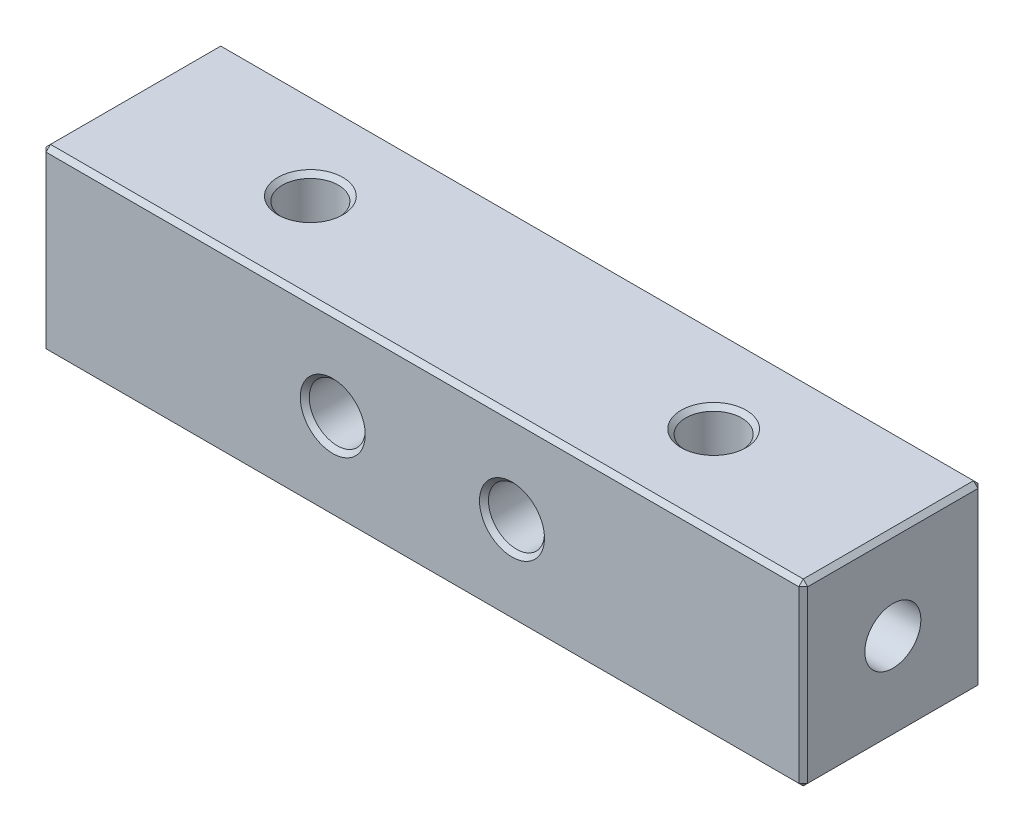
ISO-10303-21;
HEADER;
FILE_DESCRIPTION(('STEP AP214'),'2;1');
FILE_NAME('part.step','',(''),(''),'','','');
FILE_SCHEMA(('AUTOMOTIVE_DESIGN { 1 0 10303 214 1 1 1 1 }'));
ENDSEC;
DATA;
#1=APPLICATION_CONTEXT('core data for automotive mechanical design processes');
#2=APPLICATION_PROTOCOL_DEFINITION('international standard','automotive_design',2000,#1);
#3=PRODUCT_CONTEXT('',#1,'mechanical');
#4=PRODUCT('Part','Part','',(#3));
#5=PRODUCT_RELATED_PRODUCT_CATEGORY('part','',(#4));
#6=PRODUCT_DEFINITION_FORMATION('','',#4);
#7=PRODUCT_DEFINITION_CONTEXT('part definition',#1,'design');
#8=PRODUCT_DEFINITION('design','',#6,#7);
#9=PRODUCT_DEFINITION_SHAPE('','',#8);
#10=(LENGTH_UNIT() NAMED_UNIT(*) SI_UNIT(.MILLI.,.METRE.));
#11=(NAMED_UNIT(*) PLANE_ANGLE_UNIT() SI_UNIT($,.RADIAN.));
#12=(NAMED_UNIT(*) SI_UNIT($,.STERADIAN.) SOLID_ANGLE_UNIT());
#13=UNCERTAINTY_MEASURE_WITH_UNIT(LENGTH_MEASURE(1.E-05),#10,'distance_accuracy_value','');
#14=(GEOMETRIC_REPRESENTATION_CONTEXT(3) GLOBAL_UNCERTAINTY_ASSIGNED_CONTEXT((#13)) GLOBAL_UNIT_ASSIGNED_CONTEXT((#10,
#11,#12)) REPRESENTATION_CONTEXT('',''));
#15=CARTESIAN_POINT('',(0.,0.,0.));
#16=DIRECTION('',(0.,0.,1.));
#17=DIRECTION('',(1.,0.,0.));
#18=AXIS2_PLACEMENT_3D('',#15,#16,#17);
#19=CARTESIAN_POINT('',(-17.,4.,-4.));
#20=DIRECTION('',(1.,0.,0.));
#21=DIRECTION('',(0.,0.,-1.));
#22=AXIS2_PLACEMENT_3D('',#19,#20,#21);
#23=PLANE('',#22);
#24=DIRECTION('',(0.,-1.,0.));
#25=VECTOR('',#24,1.);
#26=CARTESIAN_POINT('',(-17.,4.,-3.8));
#27=LINE('',#26,#25);
#28=CARTESIAN_POINT('',(-17.,3.8,-3.8));
#29=VERTEX_POINT('',#28);
#30=CARTESIAN_POINT('',(-17.,-3.8,-3.8));
#31=VERTEX_POINT('',#30);
#32=EDGE_CURVE('E213',#29,#31,#27,.T.);
#33=ORIENTED_EDGE('',*,*,#32,.T.);
#34=DIRECTION('',(0.,0.,1.));
#35=VECTOR('',#34,1.);
#36=CARTESIAN_POINT('',(-17.,-3.8,-4.));
#37=LINE('',#36,#35);
#38=CARTESIAN_POINT('',(-17.,-3.8,3.8));
#39=VERTEX_POINT('',#38);
#40=EDGE_CURVE('E219',#31,#39,#37,.T.);
#41=ORIENTED_EDGE('',*,*,#40,.T.);
#42=DIRECTION('',(0.,1.,0.));
#43=VECTOR('',#42,1.);
#44=CARTESIAN_POINT('',(-17.,4.,3.8));
#45=LINE('',#44,#43);
#46=CARTESIAN_POINT('',(-17.,3.8,3.8));
#47=VERTEX_POINT('',#46);
#48=EDGE_CURVE('E217',#39,#47,#45,.T.);
#49=ORIENTED_EDGE('',*,*,#48,.T.);
#50=DIRECTION('',(0.,0.,-1.));
#51=VECTOR('',#50,1.);
#52=CARTESIAN_POINT('',(-17.,3.8,-4.));
#53=LINE('',#52,#51);
#54=EDGE_CURVE('E215',#47,#29,#53,.T.);
#55=ORIENTED_EDGE('',*,*,#54,.T.);
#56=EDGE_LOOP('',(#33,#41,#49,#55));
#57=FACE_BOUND('',#56,.T.);
#58=CARTESIAN_POINT('',(-17.,0.,0.));
#59=DIRECTION('',(-1.,0.,0.));
#60=DIRECTION('',(0.,0.,1.));
#61=AXIS2_PLACEMENT_3D('',#58,#59,#60);
#62=CIRCLE('',#61,1.25);
#63=CARTESIAN_POINT('',(-17.,0.,1.25));
#64=VERTEX_POINT('',#63);
#65=EDGE_CURVE('E250',#64,#64,#62,.T.);
#66=ORIENTED_EDGE('',*,*,#65,.F.);
#67=EDGE_LOOP('',(#66));
#68=FACE_BOUND('',#67,.T.);
#69=ADVANCED_FACE('F43',(#57,#68),#23,.F.);
#70=CARTESIAN_POINT('',(17.,4.,-4.));
#71=DIRECTION('',(-1.,0.,0.));
#72=DIRECTION('',(0.,0.,1.));
#73=AXIS2_PLACEMENT_3D('',#70,#71,#72);
#74=PLANE('',#73);
#75=CARTESIAN_POINT('',(17.,0.,0.));
#76=DIRECTION('',(1.,0.,0.));
#77=DIRECTION('',(0.,0.,-1.));
#78=AXIS2_PLACEMENT_3D('',#75,#76,#77);
#79=CIRCLE('',#78,1.24999999999999);
#80=CARTESIAN_POINT('',(17.,0.,-1.24999999999999));
#81=VERTEX_POINT('',#80);
#82=EDGE_CURVE('E326',#81,#81,#79,.T.);
#83=ORIENTED_EDGE('',*,*,#82,.F.);
#84=EDGE_LOOP('',(#83));
#85=FACE_BOUND('',#84,.T.);
#86=DIRECTION('',(0.,-1.,0.));
#87=VECTOR('',#86,1.);
#88=CARTESIAN_POINT('',(17.,4.,3.8));
#89=LINE('',#88,#87);
#90=CARTESIAN_POINT('',(17.,3.8,3.8));
#91=VERTEX_POINT('',#90);
#92=CARTESIAN_POINT('',(17.,-3.8,3.8));
#93=VERTEX_POINT('',#92);
#94=EDGE_CURVE('E226',#91,#93,#89,.T.);
#95=ORIENTED_EDGE('',*,*,#94,.T.);
#96=DIRECTION('',(0.,0.,-1.));
#97=VECTOR('',#96,1.);
#98=CARTESIAN_POINT('',(17.,-3.8,-4.));
#99=LINE('',#98,#97);
#100=CARTESIAN_POINT('',(17.,-3.8,-3.8));
#101=VERTEX_POINT('',#100);
#102=EDGE_CURVE('E228',#93,#101,#99,.T.);
#103=ORIENTED_EDGE('',*,*,#102,.T.);
#104=DIRECTION('',(0.,1.,0.));
#105=VECTOR('',#104,1.);
#106=CARTESIAN_POINT('',(17.,4.,-3.8));
#107=LINE('',#106,#105);
#108=CARTESIAN_POINT('',(17.,3.8,-3.8));
#109=VERTEX_POINT('',#108);
#110=EDGE_CURVE('E222',#101,#109,#107,.T.);
#111=ORIENTED_EDGE('',*,*,#110,.T.);
#112=DIRECTION('',(0.,0.,1.));
#113=VECTOR('',#112,1.);
#114=CARTESIAN_POINT('',(17.,3.8,4.));
#115=LINE('',#114,#113);
#116=EDGE_CURVE('E224',#109,#91,#115,.T.);
#117=ORIENTED_EDGE('',*,*,#116,.T.);
#118=EDGE_LOOP('',(#95,#103,#111,#117));
#119=FACE_BOUND('',#118,.T.);
#120=ADVANCED_FACE('F362',(#85,#119),#74,.F.);
#121=CARTESIAN_POINT('',(-17.,4.,-4.));
#122=DIRECTION('',(0.,0.,1.));
#123=DIRECTION('',(1.,0.,0.));
#124=AXIS2_PLACEMENT_3D('',#121,#122,#123);
#125=PLANE('',#124);
#126=DIRECTION('',(1.,0.,0.));
#127=VECTOR('',#126,1.);
#128=CARTESIAN_POINT('',(17.,3.8,-4.));
#129=LINE('',#128,#127);
#130=CARTESIAN_POINT('',(-16.8,3.8,-4.));
#131=VERTEX_POINT('',#130);
#132=CARTESIAN_POINT('',(16.8,3.8,-4.));
#133=VERTEX_POINT('',#132);
#134=EDGE_CURVE('E241',#131,#133,#129,.T.);
#135=ORIENTED_EDGE('',*,*,#134,.T.);
#136=DIRECTION('',(0.,-1.,0.));
#137=VECTOR('',#136,1.);
#138=CARTESIAN_POINT('',(16.8,4.,-4.));
#139=LINE('',#138,#137);
#140=CARTESIAN_POINT('',(16.8,-3.8,-4.));
#141=VERTEX_POINT('',#140);
#142=EDGE_CURVE('E243',#133,#141,#139,.T.);
#143=ORIENTED_EDGE('',*,*,#142,.T.);
#144=DIRECTION('',(-1.,0.,0.));
#145=VECTOR('',#144,1.);
#146=CARTESIAN_POINT('',(-17.,-3.8,-4.));
#147=LINE('',#146,#145);
#148=CARTESIAN_POINT('',(-16.8,-3.8,-4.));
#149=VERTEX_POINT('',#148);
#150=EDGE_CURVE('E237',#141,#149,#147,.T.);
#151=ORIENTED_EDGE('',*,*,#150,.T.);
#152=DIRECTION('',(0.,1.,0.));
#153=VECTOR('',#152,1.);
#154=CARTESIAN_POINT('',(-16.8,4.,-4.));
#155=LINE('',#154,#153);
#156=EDGE_CURVE('E239',#149,#131,#155,.T.);
#157=ORIENTED_EDGE('',*,*,#156,.T.);
#158=EDGE_LOOP('',(#135,#143,#151,#157));
#159=FACE_BOUND('',#158,.T.);
#160=CARTESIAN_POINT('',(-4.,0.,-4.));
#161=DIRECTION('',(0.,0.,1.));
#162=DIRECTION('',(1.,0.,0.));
#163=AXIS2_PLACEMENT_3D('',#160,#161,#162);
#164=CIRCLE('',#163,1.44999999999998);
#165=CARTESIAN_POINT('',(-2.55000000000002,0.,-4.));
#166=VERTEX_POINT('',#165);
#167=EDGE_CURVE('E234',#166,#166,#164,.T.);
#168=ORIENTED_EDGE('',*,*,#167,.T.);
#169=EDGE_LOOP('',(#168));
#170=FACE_BOUND('',#169,.T.);
#171=CARTESIAN_POINT('',(4.,0.,-4.));
#172=DIRECTION('',(0.,0.,1.));
#173=DIRECTION('',(1.,0.,0.));
#174=AXIS2_PLACEMENT_3D('',#171,#172,#173);
#175=CIRCLE('',#174,1.44999999999999);
#176=CARTESIAN_POINT('',(5.44999999999999,0.,-4.));
#177=VERTEX_POINT('',#176);
#178=EDGE_CURVE('E231',#177,#177,#175,.T.);
#179=ORIENTED_EDGE('',*,*,#178,.T.);
#180=EDGE_LOOP('',(#179));
#181=FACE_BOUND('',#180,.T.);
#182=ADVANCED_FACE('F368',(#159,#170,#181),#125,.F.);
#183=CARTESIAN_POINT('',(-17.,4.,4.));
#184=DIRECTION('',(0.,0.,-1.));
#185=DIRECTION('',(-1.,0.,0.));
#186=AXIS2_PLACEMENT_3D('',#183,#184,#185);
#187=PLANE('',#186);
#188=CARTESIAN_POINT('',(-4.,0.,4.));
#189=DIRECTION('',(0.,0.,-1.));
#190=DIRECTION('',(-1.,0.,0.));
#191=AXIS2_PLACEMENT_3D('',#188,#189,#190);
#192=CIRCLE('',#191,1.45);
#193=CARTESIAN_POINT('',(-5.45,0.,4.));
#194=VERTEX_POINT('',#193);
#195=EDGE_CURVE('E183',#194,#194,#192,.T.);
#196=ORIENTED_EDGE('',*,*,#195,.T.);
#197=EDGE_LOOP('',(#196));
#198=FACE_BOUND('',#197,.T.);
#199=CARTESIAN_POINT('',(4.,0.,4.));
#200=DIRECTION('',(0.,0.,-1.));
#201=DIRECTION('',(-1.,0.,0.));
#202=AXIS2_PLACEMENT_3D('',#199,#200,#201);
#203=CIRCLE('',#202,1.45);
#204=CARTESIAN_POINT('',(2.55000000000001,0.,4.));
#205=VERTEX_POINT('',#204);
#206=EDGE_CURVE('E180',#205,#205,#203,.T.);
#207=ORIENTED_EDGE('',*,*,#206,.T.);
#208=EDGE_LOOP('',(#207));
#209=FACE_BOUND('',#208,.T.);
#210=DIRECTION('',(-1.,0.,0.));
#211=VECTOR('',#210,1.);
#212=CARTESIAN_POINT('',(-17.,3.8,4.));
#213=LINE('',#212,#211);
#214=CARTESIAN_POINT('',(16.8,3.8,4.));
#215=VERTEX_POINT('',#214);
#216=CARTESIAN_POINT('',(-16.8,3.8,4.));
#217=VERTEX_POINT('',#216);
#218=EDGE_CURVE('E171',#215,#217,#213,.T.);
#219=ORIENTED_EDGE('',*,*,#218,.T.);
#220=DIRECTION('',(0.,-1.,0.));
#221=VECTOR('',#220,1.);
#222=CARTESIAN_POINT('',(-16.8,4.,4.));
#223=LINE('',#222,#221);
#224=CARTESIAN_POINT('',(-16.8,-3.8,4.));
#225=VERTEX_POINT('',#224);
#226=EDGE_CURVE('E177',#217,#225,#223,.T.);
#227=ORIENTED_EDGE('',*,*,#226,.T.);
#228=DIRECTION('',(1.,0.,0.));
#229=VECTOR('',#228,1.);
#230=CARTESIAN_POINT('',(-17.,-3.8,4.));
#231=LINE('',#230,#229);
#232=CARTESIAN_POINT('',(16.8,-3.8,4.));
#233=VERTEX_POINT('',#232);
#234=EDGE_CURVE('E175',#225,#233,#231,.T.);
#235=ORIENTED_EDGE('',*,*,#234,.T.);
#236=DIRECTION('',(0.,1.,0.));
#237=VECTOR('',#236,1.);
#238=CARTESIAN_POINT('',(16.8,4.,4.));
#239=LINE('',#238,#237);
#240=EDGE_CURVE('E173',#233,#215,#239,.T.);
#241=ORIENTED_EDGE('',*,*,#240,.T.);
#242=EDGE_LOOP('',(#219,#227,#235,#241));
#243=FACE_BOUND('',#242,.T.);
#244=ADVANCED_FACE('F373',(#198,#209,#243),#187,.F.);
#245=CARTESIAN_POINT('',(0.,4.,0.));
#246=DIRECTION('',(0.,1.,0.));
#247=DIRECTION('',(0.,0.,1.));
#248=AXIS2_PLACEMENT_3D('',#245,#246,#247);
#249=PLANE('',#248);
#250=CARTESIAN_POINT('',(8.99999999999999,4.,0.));
#251=DIRECTION('',(0.,1.,0.));
#252=DIRECTION('',(0.,0.,1.));
#253=AXIS2_PLACEMENT_3D('',#250,#251,#252);
#254=CIRCLE('',#253,1.44999999999999);
#255=CARTESIAN_POINT('',(8.99999999999999,4.,1.44999999999999));
#256=VERTEX_POINT('',#255);
#257=EDGE_CURVE('E210',#256,#256,#254,.F.);
#258=ORIENTED_EDGE('',*,*,#257,.T.);
#259=EDGE_LOOP('',(#258));
#260=FACE_BOUND('',#259,.T.);
#261=CARTESIAN_POINT('',(-9.00000000000001,4.,0.));
#262=DIRECTION('',(0.,1.,0.));
#263=DIRECTION('',(0.,0.,1.));
#264=AXIS2_PLACEMENT_3D('',#261,#262,#263);
#265=CIRCLE('',#264,1.44999999999998);
#266=CARTESIAN_POINT('',(-9.00000000000001,4.,1.44999999999998));
#267=VERTEX_POINT('',#266);
#268=EDGE_CURVE('E207',#267,#267,#265,.F.);
#269=ORIENTED_EDGE('',*,*,#268,.T.);
#270=EDGE_LOOP('',(#269));
#271=FACE_BOUND('',#270,.T.);
#272=DIRECTION('',(0.,0.,1.));
#273=VECTOR('',#272,1.);
#274=CARTESIAN_POINT('',(-16.8,4.,4.));
#275=LINE('',#274,#273);
#276=CARTESIAN_POINT('',(-16.8,4.,-3.8));
#277=VERTEX_POINT('',#276);
#278=CARTESIAN_POINT('',(-16.8,4.,3.8));
#279=VERTEX_POINT('',#278);
#280=EDGE_CURVE('E202',#277,#279,#275,.T.);
#281=ORIENTED_EDGE('',*,*,#280,.T.);
#282=DIRECTION('',(1.,0.,0.));
#283=VECTOR('',#282,1.);
#284=CARTESIAN_POINT('',(17.,4.,3.8));
#285=LINE('',#284,#283);
#286=CARTESIAN_POINT('',(16.8,4.,3.8));
#287=VERTEX_POINT('',#286);
#288=EDGE_CURVE('E204',#279,#287,#285,.T.);
#289=ORIENTED_EDGE('',*,*,#288,.T.);
#290=DIRECTION('',(0.,0.,-1.));
#291=VECTOR('',#290,1.);
#292=CARTESIAN_POINT('',(16.8,4.,-4.));
#293=LINE('',#292,#291);
#294=CARTESIAN_POINT('',(16.8,4.,-3.8));
#295=VERTEX_POINT('',#294);
#296=EDGE_CURVE('E200',#287,#295,#293,.T.);
#297=ORIENTED_EDGE('',*,*,#296,.T.);
#298=DIRECTION('',(-1.,0.,0.));
#299=VECTOR('',#298,1.);
#300=CARTESIAN_POINT('',(-17.,4.,-3.8));
#301=LINE('',#300,#299);
#302=EDGE_CURVE('E198',#295,#277,#301,.T.);
#303=ORIENTED_EDGE('',*,*,#302,.T.);
#304=EDGE_LOOP('',(#281,#289,#297,#303));
#305=FACE_BOUND('',#304,.T.);
#306=ADVANCED_FACE('F529',(#260,#271,#305),#249,.T.);
#307=CARTESIAN_POINT('',(0.,-4.,0.));
#308=DIRECTION('',(0.,1.,0.));
#309=DIRECTION('',(0.,0.,1.));
#310=AXIS2_PLACEMENT_3D('',#307,#308,#309);
#311=PLANE('',#310);
#312=CARTESIAN_POINT('',(8.99999999999999,-4.,0.));
#313=DIRECTION('',(0.,1.,0.));
#314=DIRECTION('',(0.,0.,1.));
#315=AXIS2_PLACEMENT_3D('',#312,#313,#314);
#316=CIRCLE('',#315,1.45);
#317=CARTESIAN_POINT('',(8.99999999999999,-4.,1.45));
#318=VERTEX_POINT('',#317);
#319=EDGE_CURVE('E157',#318,#318,#316,.T.);
#320=ORIENTED_EDGE('',*,*,#319,.T.);
#321=EDGE_LOOP('',(#320));
#322=FACE_BOUND('',#321,.T.);
#323=CARTESIAN_POINT('',(-9.00000000000001,-4.,0.));
#324=DIRECTION('',(0.,1.,0.));
#325=DIRECTION('',(0.,0.,1.));
#326=AXIS2_PLACEMENT_3D('',#323,#324,#325);
#327=CIRCLE('',#326,1.45);
#328=CARTESIAN_POINT('',(-9.00000000000001,-4.,1.45));
#329=VERTEX_POINT('',#328);
#330=EDGE_CURVE('E162',#329,#329,#327,.T.);
#331=ORIENTED_EDGE('',*,*,#330,.T.);
#332=EDGE_LOOP('',(#331));
#333=FACE_BOUND('',#332,.T.);
#334=DIRECTION('',(0.,0.,1.));
#335=VECTOR('',#334,1.);
#336=CARTESIAN_POINT('',(16.8,-4.,0.));
#337=LINE('',#336,#335);
#338=CARTESIAN_POINT('',(16.8,-4.,-3.8));
#339=VERTEX_POINT('',#338);
#340=CARTESIAN_POINT('',(16.8,-4.,3.8));
#341=VERTEX_POINT('',#340);
#342=EDGE_CURVE('E332',#339,#341,#337,.T.);
#343=ORIENTED_EDGE('',*,*,#342,.T.);
#344=DIRECTION('',(-1.,0.,0.));
#345=VECTOR('',#344,1.);
#346=CARTESIAN_POINT('',(0.,-4.,3.8));
#347=LINE('',#346,#345);
#348=CARTESIAN_POINT('',(-16.8,-4.,3.8));
#349=VERTEX_POINT('',#348);
#350=EDGE_CURVE('E337',#341,#349,#347,.T.);
#351=ORIENTED_EDGE('',*,*,#350,.T.);
#352=DIRECTION('',(0.,0.,-1.));
#353=VECTOR('',#352,1.);
#354=CARTESIAN_POINT('',(-16.8,-4.,0.));
#355=LINE('',#354,#353);
#356=CARTESIAN_POINT('',(-16.8,-4.,-3.8));
#357=VERTEX_POINT('',#356);
#358=EDGE_CURVE('E334',#349,#357,#355,.T.);
#359=ORIENTED_EDGE('',*,*,#358,.T.);
#360=DIRECTION('',(1.,0.,0.));
#361=VECTOR('',#360,1.);
#362=CARTESIAN_POINT('',(0.,-4.,-3.8));
#363=LINE('',#362,#361);
#364=EDGE_CURVE('E315',#357,#339,#363,.T.);
#365=ORIENTED_EDGE('',*,*,#364,.T.);
#366=EDGE_LOOP('',(#343,#351,#359,#365));
#367=FACE_BOUND('',#366,.T.);
#368=ADVANCED_FACE('F147',(#322,#333,#367),#311,.F.);
#369=CARTESIAN_POINT('',(8.99999999999999,4.,0.));
#370=DIRECTION('',(0.,1.,0.));
#371=DIRECTION('',(0.,0.,1.));
#372=AXIS2_PLACEMENT_3D('',#369,#370,#371);
#373=CYLINDRICAL_SURFACE('',#372,1.24999999999999);
#374=CARTESIAN_POINT('',(8.99999999999999,0.,0.));
#375=DIRECTION('',(-0.707106781186547,0.707106781186547,0.));
#376=DIRECTION('',(0.707106781186547,0.707106781186547,0.));
#377=AXIS2_PLACEMENT_3D('',#374,#375,#376);
#378=ELLIPSE('',#377,1.76776695296636,1.24999999999999);
#379=CARTESIAN_POINT('',(8.99999999999999,0.,-1.25));
#380=VERTEX_POINT('',#379);
#381=CARTESIAN_POINT('',(8.99999999999999,0.,1.24999999999999));
#382=VERTEX_POINT('',#381);
#383=EDGE_CURVE('E52',#380,#382,#378,.F.);
#384=ORIENTED_EDGE('',*,*,#383,.T.);
#385=CARTESIAN_POINT('',(8.99999999999999,0.,0.));
#386=DIRECTION('',(0.707106781186547,0.707106781186547,0.));
#387=DIRECTION('',(-0.707106781186547,0.707106781186547,0.));
#388=AXIS2_PLACEMENT_3D('',#385,#386,#387);
#389=ELLIPSE('',#388,1.76776695296636,1.24999999999999);
#390=EDGE_CURVE('E11',#382,#380,#389,.T.);
#391=ORIENTED_EDGE('',*,*,#390,.T.);
#392=EDGE_LOOP('',(#384,#391));
#393=FACE_BOUND('',#392,.T.);
#394=CARTESIAN_POINT('',(8.99999999999999,-3.79999999999999,0.));
#395=DIRECTION('',(0.,1.,0.));
#396=DIRECTION('',(0.,0.,1.));
#397=AXIS2_PLACEMENT_3D('',#394,#395,#396);
#398=CIRCLE('',#397,1.24999999999999);
#399=CARTESIAN_POINT('',(8.99999999999999,-3.79999999999999,1.24999999999999));
#400=VERTEX_POINT('',#399);
#401=EDGE_CURVE('E152',#400,#400,#398,.F.);
#402=ORIENTED_EDGE('',*,*,#401,.T.);
#403=EDGE_LOOP('',(#402));
#404=FACE_BOUND('',#403,.T.);
#405=CARTESIAN_POINT('',(8.99999999999999,3.8,0.));
#406=DIRECTION('',(0.,1.,0.));
#407=DIRECTION('',(0.,0.,1.));
#408=AXIS2_PLACEMENT_3D('',#405,#406,#407);
#409=CIRCLE('',#408,1.24999999999999);
#410=CARTESIAN_POINT('',(8.99999999999999,3.8,1.24999999999999));
#411=VERTEX_POINT('',#410);
#412=EDGE_CURVE('E155',#411,#411,#409,.T.);
#413=ORIENTED_EDGE('',*,*,#412,.T.);
#414=EDGE_LOOP('',(#413));
#415=FACE_BOUND('',#414,.T.);
#416=ADVANCED_FACE('F143',(#393,#404,#415),#373,.F.);
#417=CARTESIAN_POINT('',(-9.00000000000001,4.,0.));
#418=DIRECTION('',(0.,1.,0.));
#419=DIRECTION('',(0.,0.,1.));
#420=AXIS2_PLACEMENT_3D('',#417,#418,#419);
#421=CYLINDRICAL_SURFACE('',#420,1.24999999999999);
#422=CARTESIAN_POINT('',(-9.00000000000001,0.,0.));
#423=DIRECTION('',(0.707106781186547,0.707106781186547,0.));
#424=DIRECTION('',(-0.707106781186547,0.707106781186547,0.));
#425=AXIS2_PLACEMENT_3D('',#422,#423,#424);
#426=ELLIPSE('',#425,1.76776695296636,1.25);
#427=CARTESIAN_POINT('',(-9.00000000000001,0.,1.25));
#428=VERTEX_POINT('',#427);
#429=CARTESIAN_POINT('',(-9.00000000000001,0.,-1.25));
#430=VERTEX_POINT('',#429);
#431=EDGE_CURVE('E246',#428,#430,#426,.F.);
#432=ORIENTED_EDGE('',*,*,#431,.T.);
#433=CARTESIAN_POINT('',(-9.00000000000001,0.,0.));
#434=DIRECTION('',(-0.707106781186547,0.707106781186547,0.));
#435=DIRECTION('',(0.707106781186547,0.707106781186547,0.));
#436=AXIS2_PLACEMENT_3D('',#433,#434,#435);
#437=ELLIPSE('',#436,1.76776695296636,1.25);
#438=EDGE_CURVE('E63',#430,#428,#437,.T.);
#439=ORIENTED_EDGE('',*,*,#438,.T.);
#440=EDGE_LOOP('',(#432,#439));
#441=FACE_BOUND('',#440,.T.);
#442=CARTESIAN_POINT('',(-9.00000000000001,-3.79999999999999,0.));
#443=DIRECTION('',(0.,1.,0.));
#444=DIRECTION('',(0.,0.,1.));
#445=AXIS2_PLACEMENT_3D('',#442,#443,#444);
#446=CIRCLE('',#445,1.24999999999999);
#447=CARTESIAN_POINT('',(-9.00000000000001,-3.79999999999999,1.24999999999999));
#448=VERTEX_POINT('',#447);
#449=EDGE_CURVE('E168',#448,#448,#446,.F.);
#450=ORIENTED_EDGE('',*,*,#449,.T.);
#451=EDGE_LOOP('',(#450));
#452=FACE_BOUND('',#451,.T.);
#453=CARTESIAN_POINT('',(-9.00000000000001,3.80000000000001,0.));
#454=DIRECTION('',(0.,1.,0.));
#455=DIRECTION('',(0.,0.,1.));
#456=AXIS2_PLACEMENT_3D('',#453,#454,#455);
#457=CIRCLE('',#456,1.24999999999999);
#458=CARTESIAN_POINT('',(-9.00000000000001,3.80000000000001,1.24999999999999));
#459=VERTEX_POINT('',#458);
#460=EDGE_CURVE('E159',#459,#459,#457,.T.);
#461=ORIENTED_EDGE('',*,*,#460,.T.);
#462=EDGE_LOOP('',(#461));
#463=FACE_BOUND('',#462,.T.);
#464=ADVANCED_FACE('F146',(#441,#452,#463),#421,.F.);
#465=CARTESIAN_POINT('',(-4.,0.,-4.));
#466=DIRECTION('',(0.,0.,-1.));
#467=DIRECTION('',(-1.,0.,0.));
#468=AXIS2_PLACEMENT_3D('',#465,#466,#467);
#469=CYLINDRICAL_SURFACE('',#468,1.24999999999999);
#470=CARTESIAN_POINT('',(-4.,0.,3.79999999999999));
#471=DIRECTION('',(0.,0.,-1.));
#472=DIRECTION('',(-1.,0.,0.));
#473=AXIS2_PLACEMENT_3D('',#470,#471,#472);
#474=CIRCLE('',#473,1.24999999999999);
#475=CARTESIAN_POINT('',(-5.24999999999999,0.,3.79999999999999));
#476=VERTEX_POINT('',#475);
#477=EDGE_CURVE('E189',#476,#476,#474,.F.);
#478=ORIENTED_EDGE('',*,*,#477,.T.);
#479=EDGE_LOOP('',(#478));
#480=FACE_BOUND('',#479,.T.);
#481=CARTESIAN_POINT('',(-4.,0.,-3.80000000000001));
#482=DIRECTION('',(0.,0.,1.));
#483=DIRECTION('',(1.,0.,0.));
#484=AXIS2_PLACEMENT_3D('',#481,#482,#483);
#485=CIRCLE('',#484,1.24999999999999);
#486=CARTESIAN_POINT('',(-2.75000000000001,0.,-3.80000000000001));
#487=VERTEX_POINT('',#486);
#488=EDGE_CURVE('E186',#487,#487,#485,.F.);
#489=ORIENTED_EDGE('',*,*,#488,.T.);
#490=EDGE_LOOP('',(#489));
#491=FACE_BOUND('',#490,.T.);
#492=ADVANCED_FACE('F517',(#480,#491),#469,.F.);
#493=CARTESIAN_POINT('',(4.,0.,-4.));
#494=DIRECTION('',(0.,0.,-1.));
#495=DIRECTION('',(-1.,0.,0.));
#496=AXIS2_PLACEMENT_3D('',#493,#494,#495);
#497=CYLINDRICAL_SURFACE('',#496,1.24999999999999);
#498=CARTESIAN_POINT('',(4.,0.,3.79999999999999));
#499=DIRECTION('',(0.,0.,-1.));
#500=DIRECTION('',(-1.,0.,0.));
#501=AXIS2_PLACEMENT_3D('',#498,#499,#500);
#502=CIRCLE('',#501,1.24999999999999);
#503=CARTESIAN_POINT('',(2.75000000000001,0.,3.79999999999999));
#504=VERTEX_POINT('',#503);
#505=EDGE_CURVE('E195',#504,#504,#502,.F.);
#506=ORIENTED_EDGE('',*,*,#505,.T.);
#507=EDGE_LOOP('',(#506));
#508=FACE_BOUND('',#507,.T.);
#509=CARTESIAN_POINT('',(4.,0.,-3.8));
#510=DIRECTION('',(0.,0.,1.));
#511=DIRECTION('',(1.,0.,0.));
#512=AXIS2_PLACEMENT_3D('',#509,#510,#511);
#513=CIRCLE('',#512,1.24999999999999);
#514=CARTESIAN_POINT('',(5.24999999999999,0.,-3.8));
#515=VERTEX_POINT('',#514);
#516=EDGE_CURVE('E192',#515,#515,#513,.F.);
#517=ORIENTED_EDGE('',*,*,#516,.T.);
#518=EDGE_LOOP('',(#517));
#519=FACE_BOUND('',#518,.T.);
#520=ADVANCED_FACE('F356',(#508,#519),#497,.F.);
#521=CARTESIAN_POINT('',(8.99999999999999,-4.,0.));
#522=DIRECTION('',(0.,-1.,0.));
#523=DIRECTION('',(0.,0.,-1.));
#524=AXIS2_PLACEMENT_3D('',#521,#522,#523);
#525=CONICAL_SURFACE('',#524,1.45,0.78539816339744);
#526=ORIENTED_EDGE('',*,*,#401,.F.);
#527=EDGE_LOOP('',(#526));
#528=FACE_BOUND('',#527,.T.);
#529=ORIENTED_EDGE('',*,*,#319,.F.);
#530=EDGE_LOOP('',(#529));
#531=FACE_BOUND('',#530,.T.);
#532=ADVANCED_FACE('F346',(#528,#531),#525,.F.);
#533=CARTESIAN_POINT('',(-9.00000000000001,-4.,0.));
#534=DIRECTION('',(0.,-1.,0.));
#535=DIRECTION('',(0.,0.,-1.));
#536=AXIS2_PLACEMENT_3D('',#533,#534,#535);
#537=CONICAL_SURFACE('',#536,1.45,0.78539816339744);
#538=ORIENTED_EDGE('',*,*,#449,.F.);
#539=EDGE_LOOP('',(#538));
#540=FACE_BOUND('',#539,.T.);
#541=ORIENTED_EDGE('',*,*,#330,.F.);
#542=EDGE_LOOP('',(#541));
#543=FACE_BOUND('',#542,.T.);
#544=ADVANCED_FACE('F343',(#540,#543),#537,.F.);
#545=CARTESIAN_POINT('',(-4.,0.,4.));
#546=DIRECTION('',(0.,0.,1.));
#547=DIRECTION('',(1.,0.,0.));
#548=AXIS2_PLACEMENT_3D('',#545,#546,#547);
#549=CONICAL_SURFACE('',#548,1.45,0.78539816339744);
#550=ORIENTED_EDGE('',*,*,#477,.F.);
#551=EDGE_LOOP('',(#550));
#552=FACE_BOUND('',#551,.T.);
#553=ORIENTED_EDGE('',*,*,#195,.F.);
#554=EDGE_LOOP('',(#553));
#555=FACE_BOUND('',#554,.T.);
#556=ADVANCED_FACE('F345',(#552,#555),#549,.F.);
#557=CARTESIAN_POINT('',(4.,0.,4.));
#558=DIRECTION('',(0.,0.,1.));
#559=DIRECTION('',(1.,0.,0.));
#560=AXIS2_PLACEMENT_3D('',#557,#558,#559);
#561=CONICAL_SURFACE('',#560,1.45,0.78539816339744);
#562=ORIENTED_EDGE('',*,*,#505,.F.);
#563=EDGE_LOOP('',(#562));
#564=FACE_BOUND('',#563,.T.);
#565=ORIENTED_EDGE('',*,*,#206,.F.);
#566=EDGE_LOOP('',(#565));
#567=FACE_BOUND('',#566,.T.);
#568=ADVANCED_FACE('F353',(#564,#567),#561,.F.);
#569=CARTESIAN_POINT('',(8.99999999999999,3.8,0.));
#570=DIRECTION('',(0.,1.,0.));
#571=DIRECTION('',(0.,0.,1.));
#572=AXIS2_PLACEMENT_3D('',#569,#570,#571);
#573=CONICAL_SURFACE('',#572,1.24999999999999,0.785398163397448);
#574=ORIENTED_EDGE('',*,*,#257,.F.);
#575=EDGE_LOOP('',(#574));
#576=FACE_BOUND('',#575,.T.);
#577=ORIENTED_EDGE('',*,*,#412,.F.);
#578=EDGE_LOOP('',(#577));
#579=FACE_BOUND('',#578,.T.);
#580=ADVANCED_FACE('F394',(#576,#579),#573,.F.);
#581=CARTESIAN_POINT('',(-9.00000000000001,3.80000000000001,0.));
#582=DIRECTION('',(0.,1.,0.));
#583=DIRECTION('',(0.,0.,1.));
#584=AXIS2_PLACEMENT_3D('',#581,#582,#583);
#585=CONICAL_SURFACE('',#584,1.24999999999999,0.785398163397448);
#586=ORIENTED_EDGE('',*,*,#268,.F.);
#587=EDGE_LOOP('',(#586));
#588=FACE_BOUND('',#587,.T.);
#589=ORIENTED_EDGE('',*,*,#460,.F.);
#590=EDGE_LOOP('',(#589));
#591=FACE_BOUND('',#590,.T.);
#592=ADVANCED_FACE('F399',(#588,#591),#585,.F.);
#593=CARTESIAN_POINT('',(16.8,4.,0.));
#594=DIRECTION('',(0.707106781186554,0.707106781186541,0.));
#595=DIRECTION('',(0.,0.,1.));
#596=AXIS2_PLACEMENT_3D('',#593,#594,#595);
#597=PLANE('',#596);
#598=DIRECTION('',(0.707106781186541,-0.707106781186554,0.));
#599=VECTOR('',#598,1.);
#600=CARTESIAN_POINT('',(16.8,4.,-3.8));
#601=LINE('',#600,#599);
#602=EDGE_CURVE('E312',#295,#109,#601,.T.);
#603=ORIENTED_EDGE('',*,*,#602,.F.);
#604=ORIENTED_EDGE('',*,*,#296,.F.);
#605=DIRECTION('',(-0.707106781186541,0.707106781186554,0.));
#606=VECTOR('',#605,1.);
#607=CARTESIAN_POINT('',(16.9,3.9,3.8));
#608=LINE('',#607,#606);
#609=EDGE_CURVE('E309',#91,#287,#608,.T.);
#610=ORIENTED_EDGE('',*,*,#609,.F.);
#611=ORIENTED_EDGE('',*,*,#116,.F.);
#612=EDGE_LOOP('',(#603,#604,#610,#611));
#613=FACE_BOUND('',#612,.T.);
#614=ADVANCED_FACE('F405',(#613),#597,.T.);
#615=CARTESIAN_POINT('',(16.8,4.,-3.8));
#616=DIRECTION('',(0.577350269189639,0.577350269189629,-0.577350269189609));
#617=DIRECTION('',(-0.707106781186541,0.707106781186554,0.));
#618=AXIS2_PLACEMENT_3D('',#615,#616,#617);
#619=PLANE('',#618);
#620=DIRECTION('',(0.,0.707106781186541,0.707106781186554));
#621=VECTOR('',#620,1.);
#622=CARTESIAN_POINT('',(16.8,4.,-3.8));
#623=LINE('',#622,#621);
#624=EDGE_CURVE('E303',#295,#133,#623,.F.);
#625=ORIENTED_EDGE('',*,*,#624,.F.);
#626=ORIENTED_EDGE('',*,*,#602,.T.);
#627=DIRECTION('',(0.707106781186535,0.,0.70710678118656));
#628=VECTOR('',#627,1.);
#629=CARTESIAN_POINT('',(16.9,3.8,-3.9));
#630=LINE('',#629,#628);
#631=EDGE_CURVE('E306',#133,#109,#630,.T.);
#632=ORIENTED_EDGE('',*,*,#631,.F.);
#633=EDGE_LOOP('',(#625,#626,#632));
#634=FACE_BOUND('',#633,.T.);
#635=ADVANCED_FACE('F410',(#634),#619,.T.);
#636=CARTESIAN_POINT('',(16.8,3.8,4.));
#637=DIRECTION('',(0.577350269189626,0.577350269189616,0.577350269189636));
#638=DIRECTION('',(0.707106781186554,0.,-0.707106781186541));
#639=AXIS2_PLACEMENT_3D('',#636,#637,#638);
#640=PLANE('',#639);
#641=DIRECTION('',(-0.707106781186554,0.,0.707106781186541));
#642=VECTOR('',#641,1.);
#643=CARTESIAN_POINT('',(16.8,3.8,4.));
#644=LINE('',#643,#642);
#645=EDGE_CURVE('E298',#91,#215,#644,.T.);
#646=ORIENTED_EDGE('',*,*,#645,.F.);
#647=ORIENTED_EDGE('',*,*,#609,.T.);
#648=DIRECTION('',(0.,-0.707106781186554,0.707106781186541));
#649=VECTOR('',#648,1.);
#650=CARTESIAN_POINT('',(16.8,3.8,4.));
#651=LINE('',#650,#649);
#652=EDGE_CURVE('E301',#215,#287,#651,.F.);
#653=ORIENTED_EDGE('',*,*,#652,.F.);
#654=EDGE_LOOP('',(#646,#647,#653));
#655=FACE_BOUND('',#654,.T.);
#656=ADVANCED_FACE('F415',(#655),#640,.T.);
#657=CARTESIAN_POINT('',(16.8,4.,-4.));
#658=DIRECTION('',(-0.70710678118656,0.,0.707106781186535));
#659=DIRECTION('',(0.,-1.,0.));
#660=AXIS2_PLACEMENT_3D('',#657,#658,#659);
#661=PLANE('',#660);
#662=ORIENTED_EDGE('',*,*,#631,.T.);
#663=ORIENTED_EDGE('',*,*,#110,.F.);
#664=DIRECTION('',(-0.707106781186535,0.,-0.70710678118656));
#665=VECTOR('',#664,1.);
#666=CARTESIAN_POINT('',(17.,-3.8,-3.8));
#667=LINE('',#666,#665);
#668=EDGE_CURVE('E293',#141,#101,#667,.F.);
#669=ORIENTED_EDGE('',*,*,#668,.F.);
#670=ORIENTED_EDGE('',*,*,#142,.F.);
#671=EDGE_LOOP('',(#662,#663,#669,#670));
#672=FACE_BOUND('',#671,.T.);
#673=ADVANCED_FACE('F420',(#672),#661,.F.);
#674=CARTESIAN_POINT('',(0.,4.,-3.8));
#675=DIRECTION('',(0.,0.707106781186554,-0.707106781186541));
#676=DIRECTION('',(1.,0.,0.));
#677=AXIS2_PLACEMENT_3D('',#674,#675,#676);
#678=PLANE('',#677);
#679=ORIENTED_EDGE('',*,*,#624,.T.);
#680=ORIENTED_EDGE('',*,*,#134,.F.);
#681=DIRECTION('',(0.,-0.707106781186541,-0.707106781186554));
#682=VECTOR('',#681,1.);
#683=CARTESIAN_POINT('',(-16.8,3.9,-3.9));
#684=LINE('',#683,#682);
#685=EDGE_CURVE('E290',#277,#131,#684,.T.);
#686=ORIENTED_EDGE('',*,*,#685,.F.);
#687=ORIENTED_EDGE('',*,*,#302,.F.);
#688=EDGE_LOOP('',(#679,#680,#686,#687));
#689=FACE_BOUND('',#688,.T.);
#690=ADVANCED_FACE('F425',(#689),#678,.T.);
#691=CARTESIAN_POINT('',(-16.8,4.,0.));
#692=DIRECTION('',(-0.707106781186554,0.707106781186541,0.));
#693=DIRECTION('',(0.,0.,-1.));
#694=AXIS2_PLACEMENT_3D('',#691,#692,#693);
#695=PLANE('',#694);
#696=DIRECTION('',(-0.707106781186541,-0.707106781186554,0.));
#697=VECTOR('',#696,1.);
#698=CARTESIAN_POINT('',(-17.,3.8,3.8));
#699=LINE('',#698,#697);
#700=EDGE_CURVE('E284',#279,#47,#699,.T.);
#701=ORIENTED_EDGE('',*,*,#700,.F.);
#702=ORIENTED_EDGE('',*,*,#280,.F.);
#703=DIRECTION('',(0.707106781186541,0.707106781186554,0.));
#704=VECTOR('',#703,1.);
#705=CARTESIAN_POINT('',(-17.,3.8,-3.8));
#706=LINE('',#705,#704);
#707=EDGE_CURVE('E287',#29,#277,#706,.T.);
#708=ORIENTED_EDGE('',*,*,#707,.F.);
#709=ORIENTED_EDGE('',*,*,#54,.F.);
#710=EDGE_LOOP('',(#701,#702,#708,#709));
#711=FACE_BOUND('',#710,.T.);
#712=ADVANCED_FACE('F430',(#711),#695,.T.);
#713=CARTESIAN_POINT('',(0.,4.,3.8));
#714=DIRECTION('',(0.,0.707106781186541,0.707106781186554));
#715=DIRECTION('',(-1.,0.,0.));
#716=AXIS2_PLACEMENT_3D('',#713,#714,#715);
#717=PLANE('',#716);
#718=ORIENTED_EDGE('',*,*,#652,.T.);
#719=ORIENTED_EDGE('',*,*,#288,.F.);
#720=DIRECTION('',(0.,0.707106781186554,-0.707106781186541));
#721=VECTOR('',#720,1.);
#722=CARTESIAN_POINT('',(-16.8,3.9,3.9));
#723=LINE('',#722,#721);
#724=EDGE_CURVE('E281',#217,#279,#723,.T.);
#725=ORIENTED_EDGE('',*,*,#724,.F.);
#726=ORIENTED_EDGE('',*,*,#218,.F.);
#727=EDGE_LOOP('',(#718,#719,#725,#726));
#728=FACE_BOUND('',#727,.T.);
#729=ADVANCED_FACE('F435',(#728),#717,.T.);
#730=CARTESIAN_POINT('',(17.,4.,3.8));
#731=DIRECTION('',(-0.707106781186541,0.,-0.707106781186554));
#732=DIRECTION('',(0.,-1.,0.));
#733=AXIS2_PLACEMENT_3D('',#730,#731,#732);
#734=PLANE('',#733);
#735=ORIENTED_EDGE('',*,*,#645,.T.);
#736=ORIENTED_EDGE('',*,*,#240,.F.);
#737=DIRECTION('',(0.707106781186554,0.,-0.707106781186541));
#738=VECTOR('',#737,1.);
#739=CARTESIAN_POINT('',(16.9,-3.8,3.9));
#740=LINE('',#739,#738);
#741=EDGE_CURVE('E278',#93,#233,#740,.F.);
#742=ORIENTED_EDGE('',*,*,#741,.F.);
#743=ORIENTED_EDGE('',*,*,#94,.F.);
#744=EDGE_LOOP('',(#735,#736,#742,#743));
#745=FACE_BOUND('',#744,.T.);
#746=ADVANCED_FACE('F440',(#745),#734,.F.);
#747=CARTESIAN_POINT('',(17.,-3.8,-4.));
#748=DIRECTION('',(-0.707106781186541,0.707106781186554,0.));
#749=DIRECTION('',(0.,0.,-1.));
#750=AXIS2_PLACEMENT_3D('',#747,#748,#749);
#751=PLANE('',#750);
#752=DIRECTION('',(0.707106781186554,0.707106781186541,0.));
#753=VECTOR('',#752,1.);
#754=CARTESIAN_POINT('',(17.,-3.8,-3.8));
#755=LINE('',#754,#753);
#756=EDGE_CURVE('E295',#101,#339,#755,.F.);
#757=ORIENTED_EDGE('',*,*,#756,.F.);
#758=ORIENTED_EDGE('',*,*,#102,.F.);
#759=DIRECTION('',(-0.707106781186554,-0.707106781186541,0.));
#760=VECTOR('',#759,1.);
#761=CARTESIAN_POINT('',(16.8,-4.,3.8));
#762=LINE('',#761,#760);
#763=EDGE_CURVE('E275',#341,#93,#762,.F.);
#764=ORIENTED_EDGE('',*,*,#763,.F.);
#765=ORIENTED_EDGE('',*,*,#342,.F.);
#766=EDGE_LOOP('',(#757,#758,#764,#765));
#767=FACE_BOUND('',#766,.T.);
#768=ADVANCED_FACE('F445',(#767),#751,.F.);
#769=CARTESIAN_POINT('',(17.,-3.8,-3.8));
#770=DIRECTION('',(0.577350269189629,-0.577350269189639,-0.577350269189609));
#771=DIRECTION('',(0.707106781186554,0.707106781186541,0.));
#772=AXIS2_PLACEMENT_3D('',#769,#770,#771);
#773=PLANE('',#772);
#774=ORIENTED_EDGE('',*,*,#668,.T.);
#775=ORIENTED_EDGE('',*,*,#756,.T.);
#776=DIRECTION('',(0.,-0.707106781186541,0.707106781186554));
#777=VECTOR('',#776,1.);
#778=CARTESIAN_POINT('',(16.8,-3.9,-3.9));
#779=LINE('',#778,#777);
#780=EDGE_CURVE('E272',#141,#339,#779,.T.);
#781=ORIENTED_EDGE('',*,*,#780,.F.);
#782=EDGE_LOOP('',(#774,#775,#781));
#783=FACE_BOUND('',#782,.T.);
#784=ADVANCED_FACE('F450',(#783),#773,.T.);
#785=CARTESIAN_POINT('',(-17.,3.8,-3.8));
#786=DIRECTION('',(-0.577350269189636,0.577350269189626,-0.577350269189616));
#787=DIRECTION('',(-0.707106781186541,-0.707106781186554,0.));
#788=AXIS2_PLACEMENT_3D('',#785,#786,#787);
#789=PLANE('',#788);
#790=ORIENTED_EDGE('',*,*,#707,.T.);
#791=ORIENTED_EDGE('',*,*,#685,.T.);
#792=DIRECTION('',(0.707106781186541,0.,-0.707106781186554));
#793=VECTOR('',#792,1.);
#794=CARTESIAN_POINT('',(-17.,3.8,-3.8));
#795=LINE('',#794,#793);
#796=EDGE_CURVE('E269',#29,#131,#795,.T.);
#797=ORIENTED_EDGE('',*,*,#796,.F.);
#798=EDGE_LOOP('',(#790,#791,#797));
#799=FACE_BOUND('',#798,.T.);
#800=ADVANCED_FACE('F455',(#799),#789,.T.);
#801=CARTESIAN_POINT('',(-17.,3.8,3.8));
#802=DIRECTION('',(-0.577350269189636,0.577350269189616,0.577350269189626));
#803=DIRECTION('',(0.707106781186541,0.,0.707106781186554));
#804=AXIS2_PLACEMENT_3D('',#801,#802,#803);
#805=PLANE('',#804);
#806=ORIENTED_EDGE('',*,*,#724,.T.);
#807=ORIENTED_EDGE('',*,*,#700,.T.);
#808=DIRECTION('',(-0.707106781186541,0.,-0.707106781186554));
#809=VECTOR('',#808,1.);
#810=CARTESIAN_POINT('',(-17.,3.8,3.8));
#811=LINE('',#810,#809);
#812=EDGE_CURVE('E266',#217,#47,#811,.T.);
#813=ORIENTED_EDGE('',*,*,#812,.F.);
#814=EDGE_LOOP('',(#806,#807,#813));
#815=FACE_BOUND('',#814,.T.);
#816=ADVANCED_FACE('F460',(#815),#805,.T.);
#817=CARTESIAN_POINT('',(16.8,-4.,3.8));
#818=DIRECTION('',(0.577350269189616,-0.577350269189636,0.577350269189626));
#819=DIRECTION('',(0.,-0.707106781186541,-0.707106781186554));
#820=AXIS2_PLACEMENT_3D('',#817,#818,#819);
#821=PLANE('',#820);
#822=ORIENTED_EDGE('',*,*,#763,.T.);
#823=ORIENTED_EDGE('',*,*,#741,.T.);
#824=DIRECTION('',(0.,0.707106781186541,0.707106781186554));
#825=VECTOR('',#824,1.);
#826=CARTESIAN_POINT('',(16.8,-4.,3.8));
#827=LINE('',#826,#825);
#828=EDGE_CURVE('E263',#341,#233,#827,.T.);
#829=ORIENTED_EDGE('',*,*,#828,.F.);
#830=EDGE_LOOP('',(#822,#823,#829));
#831=FACE_BOUND('',#830,.T.);
#832=ADVANCED_FACE('F465',(#831),#821,.T.);
#833=CARTESIAN_POINT('',(-17.,-3.8,-4.));
#834=DIRECTION('',(0.,0.707106781186554,0.707106781186541));
#835=DIRECTION('',(-1.,0.,0.));
#836=AXIS2_PLACEMENT_3D('',#833,#834,#835);
#837=PLANE('',#836);
#838=ORIENTED_EDGE('',*,*,#780,.T.);
#839=ORIENTED_EDGE('',*,*,#364,.F.);
#840=DIRECTION('',(0.,0.707106781186541,-0.707106781186554));
#841=VECTOR('',#840,1.);
#842=CARTESIAN_POINT('',(-16.8,-4.,-3.8));
#843=LINE('',#842,#841);
#844=EDGE_CURVE('E260',#149,#357,#843,.F.);
#845=ORIENTED_EDGE('',*,*,#844,.F.);
#846=ORIENTED_EDGE('',*,*,#150,.F.);
#847=EDGE_LOOP('',(#838,#839,#845,#846));
#848=FACE_BOUND('',#847,.T.);
#849=ADVANCED_FACE('F470',(#848),#837,.F.);
#850=CARTESIAN_POINT('',(-17.,4.,-3.8));
#851=DIRECTION('',(0.707106781186554,0.,0.707106781186541));
#852=DIRECTION('',(0.,-1.,0.));
#853=AXIS2_PLACEMENT_3D('',#850,#851,#852);
#854=PLANE('',#853);
#855=ORIENTED_EDGE('',*,*,#796,.T.);
#856=ORIENTED_EDGE('',*,*,#156,.F.);
#857=DIRECTION('',(-0.707106781186541,0.,0.707106781186554));
#858=VECTOR('',#857,1.);
#859=CARTESIAN_POINT('',(-16.9,-3.8,-3.9));
#860=LINE('',#859,#858);
#861=EDGE_CURVE('E257',#31,#149,#860,.F.);
#862=ORIENTED_EDGE('',*,*,#861,.F.);
#863=ORIENTED_EDGE('',*,*,#32,.F.);
#864=EDGE_LOOP('',(#855,#856,#862,#863));
#865=FACE_BOUND('',#864,.T.);
#866=ADVANCED_FACE('F475',(#865),#854,.F.);
#867=CARTESIAN_POINT('',(-16.8,4.,4.));
#868=DIRECTION('',(0.707106781186554,0.,-0.707106781186541));
#869=DIRECTION('',(0.,-1.,0.));
#870=AXIS2_PLACEMENT_3D('',#867,#868,#869);
#871=PLANE('',#870);
#872=ORIENTED_EDGE('',*,*,#812,.T.);
#873=ORIENTED_EDGE('',*,*,#48,.F.);
#874=DIRECTION('',(0.707106781186541,0.,0.707106781186554));
#875=VECTOR('',#874,1.);
#876=CARTESIAN_POINT('',(-17.,-3.8,3.8));
#877=LINE('',#876,#875);
#878=EDGE_CURVE('E254',#225,#39,#877,.F.);
#879=ORIENTED_EDGE('',*,*,#878,.F.);
#880=ORIENTED_EDGE('',*,*,#226,.F.);
#881=EDGE_LOOP('',(#872,#873,#879,#880));
#882=FACE_BOUND('',#881,.T.);
#883=ADVANCED_FACE('F480',(#882),#871,.F.);
#884=CARTESIAN_POINT('',(-17.,-3.8,4.));
#885=DIRECTION('',(0.,0.707106781186554,-0.707106781186541));
#886=DIRECTION('',(1.,0.,0.));
#887=AXIS2_PLACEMENT_3D('',#884,#885,#886);
#888=PLANE('',#887);
#889=ORIENTED_EDGE('',*,*,#828,.T.);
#890=ORIENTED_EDGE('',*,*,#234,.F.);
#891=DIRECTION('',(0.,-0.707106781186541,-0.707106781186554));
#892=VECTOR('',#891,1.);
#893=CARTESIAN_POINT('',(-16.8,-3.9,3.9));
#894=LINE('',#893,#892);
#895=EDGE_CURVE('E252',#349,#225,#894,.F.);
#896=ORIENTED_EDGE('',*,*,#895,.F.);
#897=ORIENTED_EDGE('',*,*,#350,.F.);
#898=EDGE_LOOP('',(#889,#890,#896,#897));
#899=FACE_BOUND('',#898,.T.);
#900=ADVANCED_FACE('F485',(#899),#888,.F.);
#901=CARTESIAN_POINT('',(-16.8,-4.,-3.8));
#902=DIRECTION('',(-0.577350269189626,-0.577350269189636,-0.577350269189616));
#903=DIRECTION('',(0.707106781186554,-0.707106781186541,0.));
#904=AXIS2_PLACEMENT_3D('',#901,#902,#903);
#905=PLANE('',#904);
#906=ORIENTED_EDGE('',*,*,#861,.T.);
#907=ORIENTED_EDGE('',*,*,#844,.T.);
#908=DIRECTION('',(0.707106781186554,-0.707106781186541,0.));
#909=VECTOR('',#908,1.);
#910=CARTESIAN_POINT('',(-16.8,-4.,-3.8));
#911=LINE('',#910,#909);
#912=EDGE_CURVE('E249',#31,#357,#911,.T.);
#913=ORIENTED_EDGE('',*,*,#912,.F.);
#914=EDGE_LOOP('',(#906,#907,#913));
#915=FACE_BOUND('',#914,.T.);
#916=ADVANCED_FACE('F490',(#915),#905,.T.);
#917=CARTESIAN_POINT('',(-17.,-3.8,3.8));
#918=DIRECTION('',(-0.577350269189626,-0.577350269189636,0.577350269189616));
#919=DIRECTION('',(0.707106781186554,-0.707106781186541,0.));
#920=AXIS2_PLACEMENT_3D('',#917,#918,#919);
#921=PLANE('',#920);
#922=ORIENTED_EDGE('',*,*,#895,.T.);
#923=ORIENTED_EDGE('',*,*,#878,.T.);
#924=DIRECTION('',(-0.707106781186554,0.707106781186541,0.));
#925=VECTOR('',#924,1.);
#926=CARTESIAN_POINT('',(-17.,-3.8,3.8));
#927=LINE('',#926,#925);
#928=EDGE_CURVE('E247',#349,#39,#927,.T.);
#929=ORIENTED_EDGE('',*,*,#928,.F.);
#930=EDGE_LOOP('',(#922,#923,#929));
#931=FACE_BOUND('',#930,.T.);
#932=ADVANCED_FACE('F495',(#931),#921,.T.);
#933=CARTESIAN_POINT('',(-17.,-3.8,-4.));
#934=DIRECTION('',(0.707106781186541,0.707106781186554,0.));
#935=DIRECTION('',(0.,0.,1.));
#936=AXIS2_PLACEMENT_3D('',#933,#934,#935);
#937=PLANE('',#936);
#938=ORIENTED_EDGE('',*,*,#912,.T.);
#939=ORIENTED_EDGE('',*,*,#358,.F.);
#940=ORIENTED_EDGE('',*,*,#928,.T.);
#941=ORIENTED_EDGE('',*,*,#40,.F.);
#942=EDGE_LOOP('',(#938,#939,#940,#941));
#943=FACE_BOUND('',#942,.T.);
#944=ADVANCED_FACE('F499',(#943),#937,.F.);
#945=CARTESIAN_POINT('',(-4.,0.,-3.80000000000001));
#946=DIRECTION('',(0.,0.,-1.));
#947=DIRECTION('',(-1.,0.,0.));
#948=AXIS2_PLACEMENT_3D('',#945,#946,#947);
#949=CONICAL_SURFACE('',#948,1.24999999999999,0.785398163397448);
#950=ORIENTED_EDGE('',*,*,#167,.F.);
#951=EDGE_LOOP('',(#950));
#952=FACE_BOUND('',#951,.T.);
#953=ORIENTED_EDGE('',*,*,#488,.F.);
#954=EDGE_LOOP('',(#953));
#955=FACE_BOUND('',#954,.T.);
#956=ADVANCED_FACE('F502',(#952,#955),#949,.F.);
#957=CARTESIAN_POINT('',(4.,0.,-3.8));
#958=DIRECTION('',(0.,0.,-1.));
#959=DIRECTION('',(-1.,0.,0.));
#960=AXIS2_PLACEMENT_3D('',#957,#958,#959);
#961=CONICAL_SURFACE('',#960,1.24999999999999,0.785398163397448);
#962=ORIENTED_EDGE('',*,*,#178,.F.);
#963=EDGE_LOOP('',(#962));
#964=FACE_BOUND('',#963,.T.);
#965=ORIENTED_EDGE('',*,*,#516,.F.);
#966=EDGE_LOOP('',(#965));
#967=FACE_BOUND('',#966,.T.);
#968=ADVANCED_FACE('F46',(#964,#967),#961,.F.);
#969=CARTESIAN_POINT('',(-17.,0.,0.));
#970=DIRECTION('',(-1.,0.,0.));
#971=DIRECTION('',(0.,0.,1.));
#972=AXIS2_PLACEMENT_3D('',#969,#970,#971);
#973=CYLINDRICAL_SURFACE('',#972,1.25);
#974=ORIENTED_EDGE('',*,*,#431,.F.);
#975=ORIENTED_EDGE('',*,*,#438,.F.);
#976=EDGE_LOOP('',(#974,#975));
#977=FACE_BOUND('',#976,.T.);
#978=ORIENTED_EDGE('',*,*,#65,.T.);
#979=EDGE_LOOP('',(#978));
#980=FACE_BOUND('',#979,.T.);
#981=ADVANCED_FACE('F319',(#977,#980),#973,.F.);
#982=CARTESIAN_POINT('',(17.,0.,0.));
#983=DIRECTION('',(1.,0.,0.));
#984=DIRECTION('',(0.,0.,-1.));
#985=AXIS2_PLACEMENT_3D('',#982,#983,#984);
#986=CYLINDRICAL_SURFACE('',#985,1.24999999999999);
#987=ORIENTED_EDGE('',*,*,#383,.F.);
#988=ORIENTED_EDGE('',*,*,#390,.F.);
#989=EDGE_LOOP('',(#987,#988));
#990=FACE_BOUND('',#989,.T.);
#991=ORIENTED_EDGE('',*,*,#82,.T.);
#992=EDGE_LOOP('',(#991));
#993=FACE_BOUND('',#992,.T.);
#994=ADVANCED_FACE('F140',(#990,#993),#986,.F.);
#995=CLOSED_SHELL('',(#69,#120,#182,#244,#306,#368,#416,#464,#492,#520,#532,#544,#556,#568,#580,
#592,#614,#635,#656,#673,#690,#712,#729,#746,#768,#784,#800,#816,#832,#849,#866,#883,#900,#916,
#932,#944,#956,#968,#981,#994));
#996=MANIFOLD_SOLID_BREP('B2',#995);
#997=ADVANCED_BREP_SHAPE_REPRESENTATION('',(#18,#996),#14);
#998=SHAPE_DEFINITION_REPRESENTATION(#9,#997);
ENDSEC;
END-ISO-10303-21;
